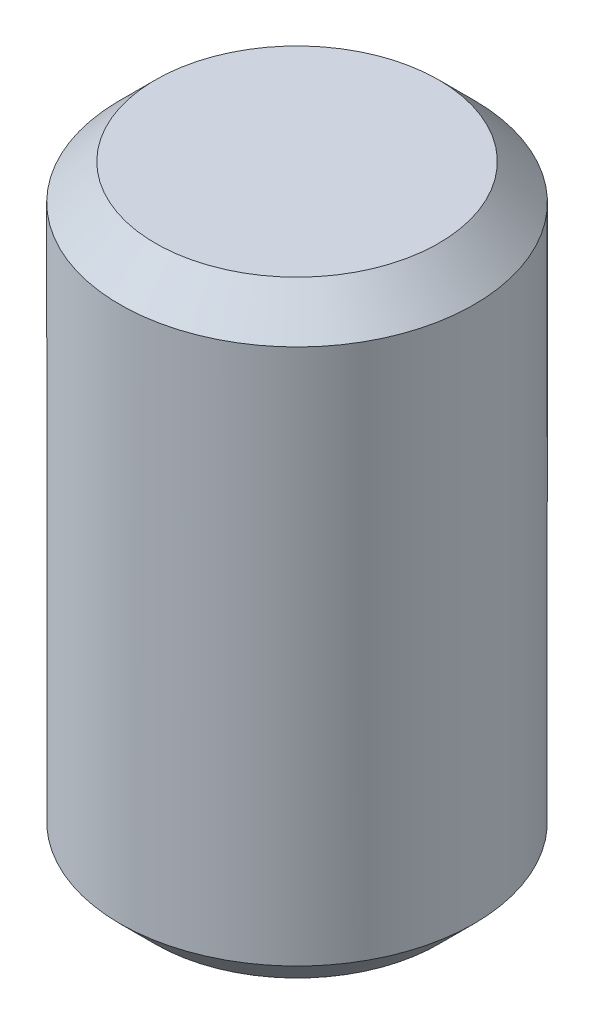
ISO-10303-21;
HEADER;
FILE_DESCRIPTION(('STEP AP214'),'2;1');
FILE_NAME('part.step','',(''),(''),'','','');
FILE_SCHEMA(('AUTOMOTIVE_DESIGN { 1 0 10303 214 1 1 1 1 }'));
ENDSEC;
DATA;
#1=APPLICATION_CONTEXT('core data for automotive mechanical design processes');
#2=APPLICATION_PROTOCOL_DEFINITION('international standard','automotive_design',2000,#1);
#3=PRODUCT_CONTEXT('',#1,'mechanical');
#4=PRODUCT('Part','Part','',(#3));
#5=PRODUCT_RELATED_PRODUCT_CATEGORY('part','',(#4));
#6=PRODUCT_DEFINITION_FORMATION('','',#4);
#7=PRODUCT_DEFINITION_CONTEXT('part definition',#1,'design');
#8=PRODUCT_DEFINITION('design','',#6,#7);
#9=PRODUCT_DEFINITION_SHAPE('','',#8);
#10=(LENGTH_UNIT() NAMED_UNIT(*) SI_UNIT(.MILLI.,.METRE.));
#11=(NAMED_UNIT(*) PLANE_ANGLE_UNIT() SI_UNIT($,.RADIAN.));
#12=(NAMED_UNIT(*) SI_UNIT($,.STERADIAN.) SOLID_ANGLE_UNIT());
#13=UNCERTAINTY_MEASURE_WITH_UNIT(LENGTH_MEASURE(1.E-05),#10,'distance_accuracy_value','');
#14=(GEOMETRIC_REPRESENTATION_CONTEXT(3) GLOBAL_UNCERTAINTY_ASSIGNED_CONTEXT((#13)) GLOBAL_UNIT_ASSIGNED_CONTEXT((#10,
#11,#12)) REPRESENTATION_CONTEXT('',''));
#15=CARTESIAN_POINT('',(0.,0.,0.));
#16=DIRECTION('',(0.,0.,1.));
#17=DIRECTION('',(1.,0.,0.));
#18=AXIS2_PLACEMENT_3D('',#15,#16,#17);
#19=CARTESIAN_POINT('',(0.,6.,0.));
#20=DIRECTION('',(0.,-1.,0.));
#21=DIRECTION('',(0.,0.,-1.));
#22=AXIS2_PLACEMENT_3D('',#19,#20,#21);
#23=CYLINDRICAL_SURFACE('',#22,1.75);
#24=CARTESIAN_POINT('',(0.,0.35,0.));
#25=DIRECTION('',(0.,1.,0.));
#26=DIRECTION('',(0.,0.,1.));
#27=AXIS2_PLACEMENT_3D('',#24,#25,#26);
#28=CIRCLE('',#27,1.75);
#29=CARTESIAN_POINT('',(0.,0.35,-1.75));
#30=VERTEX_POINT('',#29);
#31=EDGE_CURVE('E59',#30,#30,#28,.T.);
#32=CARTESIAN_POINT('',(0.,5.65,0.));
#33=DIRECTION('',(0.,1.,0.));
#34=DIRECTION('',(0.,0.,1.));
#35=AXIS2_PLACEMENT_3D('',#32,#33,#34);
#36=CIRCLE('',#35,1.75);
#37=CARTESIAN_POINT('',(0.,5.65,-1.75));
#38=VERTEX_POINT('',#37);
#39=EDGE_CURVE('E64',#38,#38,#36,.F.);
#40=CARTESIAN_POINT('',(0.,0.35,-1.75));
#41=CARTESIAN_POINT('',(0.,0.405208333333333,-1.75));
#42=CARTESIAN_POINT('',(0.,0.460416666666666,-1.75));
#43=CARTESIAN_POINT('',(0.,0.570833333333333,-1.75));
#44=CARTESIAN_POINT('',(0.,0.626041666666666,-1.75));
#45=CARTESIAN_POINT('',(0.,0.736458333333333,-1.75));
#46=CARTESIAN_POINT('',(0.,0.791666666666666,-1.75));
#47=CARTESIAN_POINT('',(0.,0.902083333333333,-1.75));
#48=CARTESIAN_POINT('',(0.,0.957291666666666,-1.75));
#49=CARTESIAN_POINT('',(0.,1.06770833333333,-1.75));
#50=CARTESIAN_POINT('',(0.,1.12291666666667,-1.75));
#51=CARTESIAN_POINT('',(0.,1.23333333333333,-1.75));
#52=CARTESIAN_POINT('',(0.,1.28854166666667,-1.75));
#53=CARTESIAN_POINT('',(0.,1.39895833333333,-1.75));
#54=CARTESIAN_POINT('',(0.,1.45416666666667,-1.75));
#55=CARTESIAN_POINT('',(0.,1.56458333333333,-1.75));
#56=CARTESIAN_POINT('',(0.,1.61979166666667,-1.75));
#57=CARTESIAN_POINT('',(0.,1.73020833333333,-1.75));
#58=CARTESIAN_POINT('',(0.,1.78541666666667,-1.75));
#59=CARTESIAN_POINT('',(0.,1.89583333333333,-1.75));
#60=CARTESIAN_POINT('',(0.,1.95104166666667,-1.75));
#61=CARTESIAN_POINT('',(0.,2.06145833333333,-1.75));
#62=CARTESIAN_POINT('',(0.,2.11666666666667,-1.75));
#63=CARTESIAN_POINT('',(0.,2.22708333333333,-1.75));
#64=CARTESIAN_POINT('',(0.,2.28229166666667,-1.75));
#65=CARTESIAN_POINT('',(0.,2.39270833333333,-1.75));
#66=CARTESIAN_POINT('',(0.,2.44791666666667,-1.75));
#67=CARTESIAN_POINT('',(0.,2.55833333333333,-1.75));
#68=CARTESIAN_POINT('',(0.,2.61354166666667,-1.75));
#69=CARTESIAN_POINT('',(0.,2.72395833333333,-1.75));
#70=CARTESIAN_POINT('',(0.,2.77916666666667,-1.75));
#71=CARTESIAN_POINT('',(0.,2.88958333333333,-1.75));
#72=CARTESIAN_POINT('',(0.,2.94479166666667,-1.75));
#73=CARTESIAN_POINT('',(0.,3.05520833333333,-1.75));
#74=CARTESIAN_POINT('',(0.,3.11041666666667,-1.75));
#75=CARTESIAN_POINT('',(0.,3.22083333333333,-1.75));
#76=CARTESIAN_POINT('',(0.,3.27604166666667,-1.75));
#77=CARTESIAN_POINT('',(0.,3.38645833333333,-1.75));
#78=CARTESIAN_POINT('',(0.,3.44166666666667,-1.75));
#79=CARTESIAN_POINT('',(0.,3.55208333333333,-1.75));
#80=CARTESIAN_POINT('',(0.,3.60729166666667,-1.75));
#81=CARTESIAN_POINT('',(0.,3.71770833333333,-1.75));
#82=CARTESIAN_POINT('',(0.,3.77291666666667,-1.75));
#83=CARTESIAN_POINT('',(0.,3.88333333333333,-1.75));
#84=CARTESIAN_POINT('',(0.,3.93854166666667,-1.75));
#85=CARTESIAN_POINT('',(0.,4.04895833333333,-1.75));
#86=CARTESIAN_POINT('',(0.,4.10416666666667,-1.75));
#87=CARTESIAN_POINT('',(0.,4.21458333333333,-1.75));
#88=CARTESIAN_POINT('',(0.,4.26979166666667,-1.75));
#89=CARTESIAN_POINT('',(0.,4.38020833333333,-1.75));
#90=CARTESIAN_POINT('',(0.,4.43541666666667,-1.75));
#91=CARTESIAN_POINT('',(0.,4.54583333333333,-1.75));
#92=CARTESIAN_POINT('',(0.,4.60104166666667,-1.75));
#93=CARTESIAN_POINT('',(0.,4.71145833333333,-1.75));
#94=CARTESIAN_POINT('',(0.,4.76666666666667,-1.75));
#95=CARTESIAN_POINT('',(0.,4.87708333333333,-1.75));
#96=CARTESIAN_POINT('',(0.,4.93229166666667,-1.75));
#97=CARTESIAN_POINT('',(0.,5.04270833333333,-1.75));
#98=CARTESIAN_POINT('',(0.,5.09791666666667,-1.75));
#99=CARTESIAN_POINT('',(0.,5.20833333333333,-1.75));
#100=CARTESIAN_POINT('',(0.,5.26354166666667,-1.75));
#101=CARTESIAN_POINT('',(0.,5.37395833333333,-1.75));
#102=CARTESIAN_POINT('',(0.,5.42916666666667,-1.75));
#103=CARTESIAN_POINT('',(0.,5.53958333333333,-1.75));
#104=CARTESIAN_POINT('',(0.,5.59479166666667,-1.75));
#105=CARTESIAN_POINT('',(0.,5.65,-1.75));
#106=B_SPLINE_CURVE_WITH_KNOTS('',3,(#40,#41,#42,#43,#44,#45,#46,#47,#48,#49,#50,#51,#52,#53,
#54,#55,#56,#57,#58,#59,#60,#61,#62,#63,#64,#65,#66,#67,#68,#69,#70,#71,#72,#73,#74,#75,#76,#77,
#78,#79,#80,#81,#82,#83,#84,#85,#86,#87,#88,#89,#90,#91,#92,#93,#94,#95,#96,#97,#98,#99,#100,
#101,#102,#103,#104,#105),.UNSPECIFIED.,.F.,.F.,(4,2,2,2,2,2,2,2,2,2,2,2,2,2,2,2,2,2,2,2,2,2,2,
2,2,2,2,2,2,2,2,2,4),(0.,0.165625,0.33125,0.496875,0.6625,0.828125,0.99375,1.159375,1.325,
1.490625,1.65625,1.821875,1.9875,2.153125,2.31875,2.484375,2.65,2.815625,2.98125,3.146875,
3.3125,3.478125,3.64375,3.809375,3.975,4.140625,4.30625,4.471875,4.6375,4.803125,4.96875,
5.134375,5.3),.UNSPECIFIED.);
#107=EDGE_CURVE('BSEAM45',#30,#38,#106,.T.);
#108=ORIENTED_EDGE('',*,*,#31,.T.);
#109=ORIENTED_EDGE('',*,*,#39,.T.);
#110=ORIENTED_EDGE('',*,*,#107,.T.);
#111=ORIENTED_EDGE('',*,*,#107,.F.);
#112=EDGE_LOOP('',(#108,#110,#109,#111));
#113=FACE_BOUND('',#112,.T.);
#114=ADVANCED_FACE('F45',(#113),#23,.T.);
#115=CARTESIAN_POINT('',(0.,6.,0.));
#116=DIRECTION('',(0.,1.,0.));
#117=DIRECTION('',(0.,0.,1.));
#118=AXIS2_PLACEMENT_3D('',#115,#116,#117);
#119=PLANE('',#118);
#120=CARTESIAN_POINT('',(0.,6.,0.));
#121=DIRECTION('',(0.,1.,0.));
#122=DIRECTION('',(0.,0.,1.));
#123=AXIS2_PLACEMENT_3D('',#120,#121,#122);
#124=CIRCLE('',#123,1.4);
#125=CARTESIAN_POINT('',(0.,6.,-1.4));
#126=VERTEX_POINT('',#125);
#127=EDGE_CURVE('E10',#126,#126,#124,.T.);
#128=ORIENTED_EDGE('',*,*,#127,.T.);
#129=EDGE_LOOP('',(#128));
#130=FACE_BOUND('',#129,.T.);
#131=ADVANCED_FACE('F81',(#130),#119,.T.);
#132=CARTESIAN_POINT('',(0.,0.,0.));
#133=DIRECTION('',(0.,1.,0.));
#134=DIRECTION('',(0.,0.,1.));
#135=AXIS2_PLACEMENT_3D('',#132,#133,#134);
#136=PLANE('',#135);
#137=CARTESIAN_POINT('',(0.,0.,0.));
#138=DIRECTION('',(0.,1.,0.));
#139=DIRECTION('',(0.,0.,1.));
#140=AXIS2_PLACEMENT_3D('',#137,#138,#139);
#141=CIRCLE('',#140,1.4);
#142=CARTESIAN_POINT('',(0.,0.,1.4));
#143=VERTEX_POINT('',#142);
#144=EDGE_CURVE('E54',#143,#143,#141,.F.);
#145=ORIENTED_EDGE('',*,*,#144,.T.);
#146=EDGE_LOOP('',(#145));
#147=FACE_BOUND('',#146,.T.);
#148=ADVANCED_FACE('F78',(#147),#136,.F.);
#149=CARTESIAN_POINT('',(0.,0.35,0.));
#150=DIRECTION('',(0.,1.,0.));
#151=DIRECTION('',(0.,0.,1.));
#152=AXIS2_PLACEMENT_3D('',#149,#150,#151);
#153=CONICAL_SURFACE('',#152,1.75,0.785398163397451);
#154=ORIENTED_EDGE('',*,*,#144,.F.);
#155=EDGE_LOOP('',(#154));
#156=FACE_BOUND('',#155,.T.);
#157=ORIENTED_EDGE('',*,*,#31,.F.);
#158=EDGE_LOOP('',(#157));
#159=FACE_BOUND('',#158,.T.);
#160=ADVANCED_FACE('F74',(#156,#159),#153,.T.);
#161=CARTESIAN_POINT('',(0.,6.,0.));
#162=DIRECTION('',(0.,-1.,0.));
#163=DIRECTION('',(0.,0.,-1.));
#164=AXIS2_PLACEMENT_3D('',#161,#162,#163);
#165=CONICAL_SURFACE('',#164,1.4,0.785398163397448);
#166=CARTESIAN_POINT('',(0.,5.65,-1.75));
#167=CARTESIAN_POINT('',(0.,5.65364583333333,-1.74635416666667));
#168=CARTESIAN_POINT('',(0.,5.65729166666667,-1.74270833333333));
#169=CARTESIAN_POINT('',(0.,5.66458333333333,-1.73541666666667));
#170=CARTESIAN_POINT('',(0.,5.66822916666667,-1.73177083333333));
#171=CARTESIAN_POINT('',(0.,5.67552083333333,-1.72447916666667));
#172=CARTESIAN_POINT('',(0.,5.67916666666667,-1.72083333333333));
#173=CARTESIAN_POINT('',(0.,5.68645833333333,-1.71354166666667));
#174=CARTESIAN_POINT('',(0.,5.69010416666667,-1.70989583333333));
#175=CARTESIAN_POINT('',(0.,5.69739583333333,-1.70260416666667));
#176=CARTESIAN_POINT('',(0.,5.70104166666667,-1.69895833333333));
#177=CARTESIAN_POINT('',(0.,5.70833333333333,-1.69166666666667));
#178=CARTESIAN_POINT('',(0.,5.71197916666667,-1.68802083333333));
#179=CARTESIAN_POINT('',(0.,5.71927083333333,-1.68072916666667));
#180=CARTESIAN_POINT('',(0.,5.72291666666667,-1.67708333333333));
#181=CARTESIAN_POINT('',(0.,5.73020833333333,-1.66979166666667));
#182=CARTESIAN_POINT('',(0.,5.73385416666667,-1.66614583333333));
#183=CARTESIAN_POINT('',(0.,5.74114583333333,-1.65885416666667));
#184=CARTESIAN_POINT('',(0.,5.74479166666667,-1.65520833333333));
#185=CARTESIAN_POINT('',(0.,5.75208333333333,-1.64791666666667));
#186=CARTESIAN_POINT('',(0.,5.75572916666667,-1.64427083333333));
#187=CARTESIAN_POINT('',(0.,5.76302083333333,-1.63697916666667));
#188=CARTESIAN_POINT('',(0.,5.76666666666667,-1.63333333333333));
#189=CARTESIAN_POINT('',(0.,5.77395833333333,-1.62604166666667));
#190=CARTESIAN_POINT('',(0.,5.77760416666667,-1.62239583333333));
#191=CARTESIAN_POINT('',(0.,5.78489583333333,-1.61510416666667));
#192=CARTESIAN_POINT('',(0.,5.78854166666667,-1.61145833333333));
#193=CARTESIAN_POINT('',(0.,5.79583333333333,-1.60416666666667));
#194=CARTESIAN_POINT('',(0.,5.79947916666667,-1.60052083333333));
#195=CARTESIAN_POINT('',(0.,5.80677083333333,-1.59322916666667));
#196=CARTESIAN_POINT('',(0.,5.81041666666667,-1.58958333333333));
#197=CARTESIAN_POINT('',(0.,5.81770833333333,-1.58229166666667));
#198=CARTESIAN_POINT('',(0.,5.82135416666667,-1.57864583333333));
#199=CARTESIAN_POINT('',(0.,5.82864583333333,-1.57135416666667));
#200=CARTESIAN_POINT('',(0.,5.83229166666667,-1.56770833333333));
#201=CARTESIAN_POINT('',(0.,5.83958333333333,-1.56041666666667));
#202=CARTESIAN_POINT('',(0.,5.84322916666667,-1.55677083333333));
#203=CARTESIAN_POINT('',(0.,5.85052083333333,-1.54947916666667));
#204=CARTESIAN_POINT('',(0.,5.85416666666667,-1.54583333333333));
#205=CARTESIAN_POINT('',(0.,5.86145833333333,-1.53854166666667));
#206=CARTESIAN_POINT('',(0.,5.86510416666667,-1.53489583333333));
#207=CARTESIAN_POINT('',(0.,5.87239583333333,-1.52760416666667));
#208=CARTESIAN_POINT('',(0.,5.87604166666667,-1.52395833333333));
#209=CARTESIAN_POINT('',(0.,5.88333333333333,-1.51666666666667));
#210=CARTESIAN_POINT('',(0.,5.88697916666667,-1.51302083333333));
#211=CARTESIAN_POINT('',(0.,5.89427083333333,-1.50572916666667));
#212=CARTESIAN_POINT('',(0.,5.89791666666667,-1.50208333333333));
#213=CARTESIAN_POINT('',(0.,5.90520833333333,-1.49479166666667));
#214=CARTESIAN_POINT('',(0.,5.90885416666667,-1.49114583333333));
#215=CARTESIAN_POINT('',(0.,5.91614583333333,-1.48385416666667));
#216=CARTESIAN_POINT('',(0.,5.91979166666667,-1.48020833333333));
#217=CARTESIAN_POINT('',(0.,5.92708333333333,-1.47291666666667));
#218=CARTESIAN_POINT('',(0.,5.93072916666667,-1.46927083333333));
#219=CARTESIAN_POINT('',(0.,5.93802083333333,-1.46197916666667));
#220=CARTESIAN_POINT('',(0.,5.94166666666667,-1.45833333333333));
#221=CARTESIAN_POINT('',(0.,5.94895833333333,-1.45104166666667));
#222=CARTESIAN_POINT('',(0.,5.95260416666667,-1.44739583333333));
#223=CARTESIAN_POINT('',(0.,5.95989583333333,-1.44010416666667));
#224=CARTESIAN_POINT('',(0.,5.96354166666667,-1.43645833333333));
#225=CARTESIAN_POINT('',(0.,5.97083333333333,-1.42916666666667));
#226=CARTESIAN_POINT('',(0.,5.97447916666667,-1.42552083333333));
#227=CARTESIAN_POINT('',(0.,5.98177083333333,-1.41822916666667));
#228=CARTESIAN_POINT('',(0.,5.98541666666667,-1.41458333333333));
#229=CARTESIAN_POINT('',(0.,5.99270833333333,-1.40729166666667));
#230=CARTESIAN_POINT('',(0.,5.99635416666667,-1.40364583333333));
#231=CARTESIAN_POINT('',(0.,6.,-1.4));
#232=B_SPLINE_CURVE_WITH_KNOTS('',3,(#166,#167,#168,#169,#170,#171,#172,#173,#174,#175,#176,
#177,#178,#179,#180,#181,#182,#183,#184,#185,#186,#187,#188,#189,#190,#191,#192,#193,#194,#195,
#196,#197,#198,#199,#200,#201,#202,#203,#204,#205,#206,#207,#208,#209,#210,#211,#212,#213,#214,
#215,#216,#217,#218,#219,#220,#221,#222,#223,#224,#225,#226,#227,#228,#229,#230,#231),
.UNSPECIFIED.,.F.,.F.,(4,2,2,2,2,2,2,2,2,2,2,2,2,2,2,2,2,2,2,2,2,2,2,2,2,2,2,2,2,2,2,2,4),(0.,
0.0154679608384562,0.0309359216769116,0.0464038825153676,0.0618718433538232,0.0773398041922787,
0.0928077650307347,0.10827572586919,0.123743686707646,0.139211647546102,0.154679608384557,
0.170147569223013,0.185615530061469,0.201083490899924,0.21655145173838,0.232019412576836,
0.247487373415291,0.262955334253747,0.278423295092203,0.293891255930659,0.309359216769114,
0.32482717760757,0.340295138446026,0.355763099284482,0.371231060122937,0.386699020961393,
0.402166981799848,0.417634942638305,0.43310290347676,0.448570864315216,0.464038825153672,
0.479506785992127,0.494974746830583),.UNSPECIFIED.);
#233=EDGE_CURVE('BSEAM48',#38,#126,#232,.T.);
#234=ORIENTED_EDGE('',*,*,#39,.F.);
#235=ORIENTED_EDGE('',*,*,#127,.F.);
#236=ORIENTED_EDGE('',*,*,#233,.T.);
#237=ORIENTED_EDGE('',*,*,#233,.F.);
#238=EDGE_LOOP('',(#234,#236,#235,#237));
#239=FACE_BOUND('',#238,.T.);
#240=ADVANCED_FACE('F48',(#239),#165,.T.);
#241=CLOSED_SHELL('',(#114,#131,#148,#160,#240));
#242=MANIFOLD_SOLID_BREP('B2',#241);
#243=ADVANCED_BREP_SHAPE_REPRESENTATION('',(#18,#242),#14);
#244=SHAPE_DEFINITION_REPRESENTATION(#9,#243);
ENDSEC;
END-ISO-10303-21;
